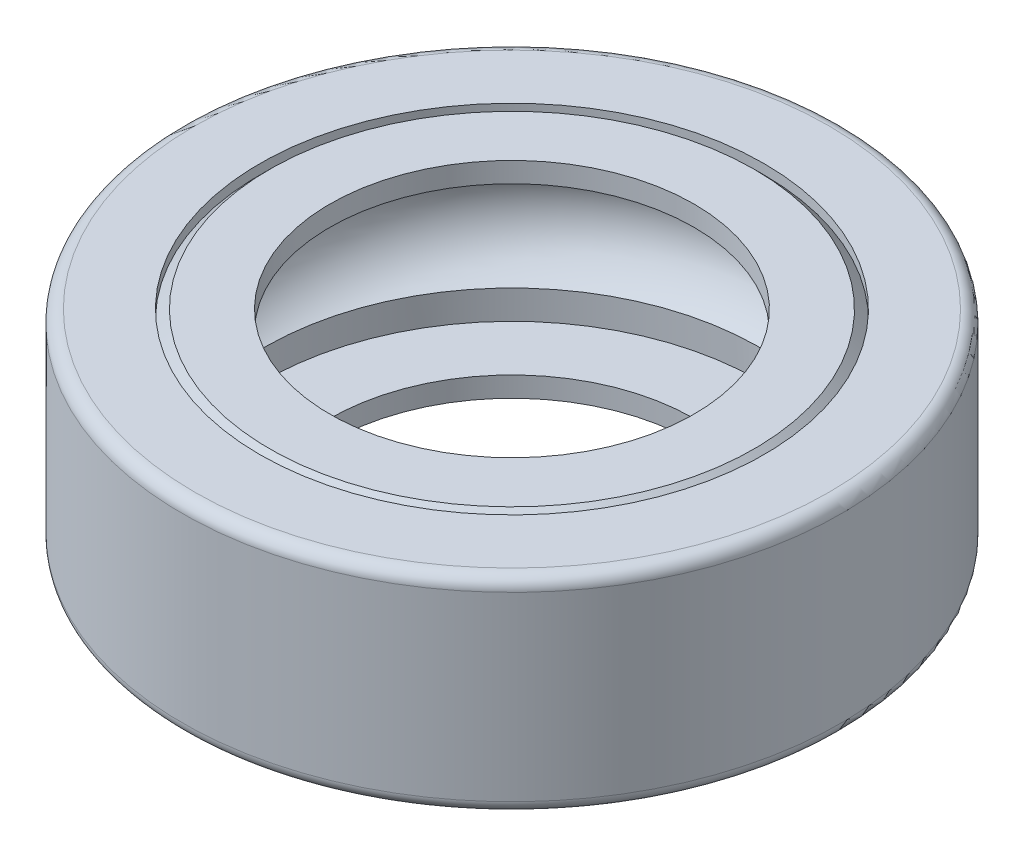
ISO-10303-21;
HEADER;
FILE_DESCRIPTION(('STEP AP214'),'2;1');
FILE_NAME('part.step','',(''),(''),'','','');
FILE_SCHEMA(('AUTOMOTIVE_DESIGN { 1 0 10303 214 1 1 1 1 }'));
ENDSEC;
DATA;
#1=APPLICATION_CONTEXT('core data for automotive mechanical design processes');
#2=APPLICATION_PROTOCOL_DEFINITION('international standard','automotive_design',2000,#1);
#3=PRODUCT_CONTEXT('',#1,'mechanical');
#4=PRODUCT('Part','Part','',(#3));
#5=PRODUCT_RELATED_PRODUCT_CATEGORY('part','',(#4));
#6=PRODUCT_DEFINITION_FORMATION('','',#4);
#7=PRODUCT_DEFINITION_CONTEXT('part definition',#1,'design');
#8=PRODUCT_DEFINITION('design','',#6,#7);
#9=PRODUCT_DEFINITION_SHAPE('','',#8);
#10=(LENGTH_UNIT() NAMED_UNIT(*) SI_UNIT(.MILLI.,.METRE.));
#11=(NAMED_UNIT(*) PLANE_ANGLE_UNIT() SI_UNIT($,.RADIAN.));
#12=(NAMED_UNIT(*) SI_UNIT($,.STERADIAN.) SOLID_ANGLE_UNIT());
#13=UNCERTAINTY_MEASURE_WITH_UNIT(LENGTH_MEASURE(1.E-05),#10,'distance_accuracy_value','');
#14=(GEOMETRIC_REPRESENTATION_CONTEXT(3) GLOBAL_UNCERTAINTY_ASSIGNED_CONTEXT((#13)) GLOBAL_UNIT_ASSIGNED_CONTEXT((#10,
#11,#12)) REPRESENTATION_CONTEXT('',''));
#15=CARTESIAN_POINT('',(0.,0.,0.));
#16=DIRECTION('',(0.,0.,1.));
#17=DIRECTION('',(1.,0.,0.));
#18=AXIS2_PLACEMENT_3D('',#15,#16,#17);
#19=CARTESIAN_POINT('',(0.,-2.5,0.));
#20=DIRECTION('',(0.,1.,0.));
#21=DIRECTION('',(0.,0.,1.));
#22=AXIS2_PLACEMENT_3D('',#19,#20,#21);
#23=CYLINDRICAL_SURFACE('',#22,8.);
#24=CARTESIAN_POINT('',(0.,-4.7,0.));
#25=DIRECTION('',(0.,1.,0.));
#26=DIRECTION('',(0.,0.,1.));
#27=AXIS2_PLACEMENT_3D('',#24,#25,#26);
#28=CIRCLE('',#27,8.);
#29=CARTESIAN_POINT('',(0.,-4.7,-8.));
#30=VERTEX_POINT('',#29);
#31=EDGE_CURVE('E10',#30,#30,#28,.T.);
#32=ORIENTED_EDGE('',*,*,#31,.T.);
#33=EDGE_LOOP('',(#32));
#34=FACE_BOUND('',#33,.T.);
#35=CARTESIAN_POINT('',(0.,-0.3,0.));
#36=DIRECTION('',(0.,1.,0.));
#37=DIRECTION('',(0.,0.,1.));
#38=AXIS2_PLACEMENT_3D('',#35,#36,#37);
#39=CIRCLE('',#38,8.);
#40=CARTESIAN_POINT('',(0.,-0.3,-8.));
#41=VERTEX_POINT('',#40);
#42=EDGE_CURVE('E180',#41,#41,#39,.T.);
#43=ORIENTED_EDGE('',*,*,#42,.F.);
#44=EDGE_LOOP('',(#43));
#45=FACE_BOUND('',#44,.T.);
#46=ADVANCED_FACE('F16',(#34,#45),#23,.T.);
#47=CARTESIAN_POINT('',(0.,-4.7,0.));
#48=DIRECTION('',(0.,1.,0.));
#49=DIRECTION('',(0.,0.,1.));
#50=AXIS2_PLACEMENT_3D('',#47,#48,#49);
#51=TOROIDAL_SURFACE('',#50,7.7,0.3);
#52=CARTESIAN_POINT('',(0.,-5.,0.));
#53=DIRECTION('',(0.,1.,0.));
#54=DIRECTION('',(0.,0.,1.));
#55=AXIS2_PLACEMENT_3D('',#52,#53,#54);
#56=CIRCLE('',#55,7.7);
#57=CARTESIAN_POINT('',(0.,-5.,-7.7));
#58=VERTEX_POINT('',#57);
#59=EDGE_CURVE('E27',#58,#58,#56,.T.);
#60=ORIENTED_EDGE('',*,*,#59,.T.);
#61=EDGE_LOOP('',(#60));
#62=FACE_BOUND('',#61,.T.);
#63=ORIENTED_EDGE('',*,*,#31,.F.);
#64=EDGE_LOOP('',(#63));
#65=FACE_BOUND('',#64,.T.);
#66=ADVANCED_FACE('F251',(#62,#65),#51,.T.);
#67=CARTESIAN_POINT('',(0.,-0.3,0.));
#68=DIRECTION('',(0.,1.,0.));
#69=DIRECTION('',(0.,0.,1.));
#70=AXIS2_PLACEMENT_3D('',#67,#68,#69);
#71=TOROIDAL_SURFACE('',#70,7.7,0.3);
#72=ORIENTED_EDGE('',*,*,#42,.T.);
#73=EDGE_LOOP('',(#72));
#74=FACE_BOUND('',#73,.T.);
#75=CARTESIAN_POINT('',(0.,0.,0.));
#76=DIRECTION('',(0.,1.,0.));
#77=DIRECTION('',(0.,0.,1.));
#78=AXIS2_PLACEMENT_3D('',#75,#76,#77);
#79=CIRCLE('',#78,7.7);
#80=CARTESIAN_POINT('',(0.,0.,-7.7));
#81=VERTEX_POINT('',#80);
#82=EDGE_CURVE('E173',#81,#81,#79,.T.);
#83=ORIENTED_EDGE('',*,*,#82,.F.);
#84=EDGE_LOOP('',(#83));
#85=FACE_BOUND('',#84,.T.);
#86=ADVANCED_FACE('F257',(#74,#85),#71,.T.);
#87=CARTESIAN_POINT('',(0.,-5.,6.91));
#88=DIRECTION('',(0.,-1.,0.));
#89=DIRECTION('',(-1.,0.,0.));
#90=AXIS2_PLACEMENT_3D('',#87,#88,#89);
#91=PLANE('',#90);
#92=ORIENTED_EDGE('',*,*,#59,.F.);
#93=EDGE_LOOP('',(#92));
#94=FACE_BOUND('',#93,.T.);
#95=CARTESIAN_POINT('',(0.,-5.,0.));
#96=DIRECTION('',(0.,1.,0.));
#97=DIRECTION('',(0.,0.,1.));
#98=AXIS2_PLACEMENT_3D('',#95,#96,#97);
#99=CIRCLE('',#98,6.12);
#100=CARTESIAN_POINT('',(0.,-5.,-6.12));
#101=VERTEX_POINT('',#100);
#102=EDGE_CURVE('E142',#101,#101,#99,.T.);
#103=ORIENTED_EDGE('',*,*,#102,.T.);
#104=EDGE_LOOP('',(#103));
#105=FACE_BOUND('',#104,.T.);
#106=ADVANCED_FACE('F290',(#94,#105),#91,.T.);
#107=CARTESIAN_POINT('',(0.,0.,6.91));
#108=DIRECTION('',(0.,1.,0.));
#109=DIRECTION('',(1.,0.,0.));
#110=AXIS2_PLACEMENT_3D('',#107,#108,#109);
#111=PLANE('',#110);
#112=CARTESIAN_POINT('',(0.,0.,0.));
#113=DIRECTION('',(0.,1.,0.));
#114=DIRECTION('',(0.,0.,1.));
#115=AXIS2_PLACEMENT_3D('',#112,#113,#114);
#116=CIRCLE('',#115,6.12);
#117=CARTESIAN_POINT('',(0.,0.,-6.12));
#118=VERTEX_POINT('',#117);
#119=EDGE_CURVE('E20',#118,#118,#116,.T.);
#120=ORIENTED_EDGE('',*,*,#119,.F.);
#121=EDGE_LOOP('',(#120));
#122=FACE_BOUND('',#121,.T.);
#123=ORIENTED_EDGE('',*,*,#82,.T.);
#124=EDGE_LOOP('',(#123));
#125=FACE_BOUND('',#124,.T.);
#126=ADVANCED_FACE('F287',(#122,#125),#111,.T.);
#127=CARTESIAN_POINT('',(0.,-4.75,0.));
#128=DIRECTION('',(0.,1.,0.));
#129=DIRECTION('',(0.,0.,1.));
#130=AXIS2_PLACEMENT_3D('',#127,#128,#129);
#131=CYLINDRICAL_SURFACE('',#130,6.12);
#132=ORIENTED_EDGE('',*,*,#102,.F.);
#133=EDGE_LOOP('',(#132));
#134=FACE_BOUND('',#133,.T.);
#135=CARTESIAN_POINT('',(0.,-4.76,0.));
#136=DIRECTION('',(0.,-1.,0.));
#137=DIRECTION('',(0.,0.,1.));
#138=AXIS2_PLACEMENT_3D('',#135,#136,#137);
#139=CIRCLE('',#138,6.12);
#140=CARTESIAN_POINT('',(0.,-4.76,-6.12));
#141=VERTEX_POINT('',#140);
#142=EDGE_CURVE('E182',#141,#141,#139,.T.);
#143=ORIENTED_EDGE('',*,*,#142,.F.);
#144=EDGE_LOOP('',(#143));
#145=FACE_BOUND('',#144,.T.);
#146=ADVANCED_FACE('F289',(#134,#145),#131,.F.);
#147=CARTESIAN_POINT('',(0.,-0.25,0.));
#148=DIRECTION('',(0.,1.,0.));
#149=DIRECTION('',(0.,0.,1.));
#150=AXIS2_PLACEMENT_3D('',#147,#148,#149);
#151=CYLINDRICAL_SURFACE('',#150,6.12);
#152=ORIENTED_EDGE('',*,*,#119,.T.);
#153=EDGE_LOOP('',(#152));
#154=FACE_BOUND('',#153,.T.);
#155=CARTESIAN_POINT('',(0.,-0.24,0.));
#156=DIRECTION('',(0.,1.,0.));
#157=DIRECTION('',(0.,0.,1.));
#158=AXIS2_PLACEMENT_3D('',#155,#156,#157);
#159=CIRCLE('',#158,6.12);
#160=CARTESIAN_POINT('',(0.,-0.24,-6.12));
#161=VERTEX_POINT('',#160);
#162=EDGE_CURVE('E189',#161,#161,#159,.T.);
#163=ORIENTED_EDGE('',*,*,#162,.F.);
#164=EDGE_LOOP('',(#163));
#165=FACE_BOUND('',#164,.T.);
#166=ADVANCED_FACE('F293',(#154,#165),#151,.F.);
#167=CARTESIAN_POINT('',(0.,-4.88,0.));
#168=DIRECTION('',(0.,1.,0.));
#169=DIRECTION('',(0.,0.,1.));
#170=AXIS2_PLACEMENT_3D('',#167,#168,#169);
#171=CONICAL_SURFACE('',#170,6.,0.785398163397449);
#172=ORIENTED_EDGE('',*,*,#142,.T.);
#173=EDGE_LOOP('',(#172));
#174=FACE_BOUND('',#173,.T.);
#175=CARTESIAN_POINT('',(0.,-5.,0.));
#176=DIRECTION('',(0.,-1.,0.));
#177=DIRECTION('',(0.,0.,1.));
#178=AXIS2_PLACEMENT_3D('',#175,#176,#177);
#179=CIRCLE('',#178,5.88);
#180=CARTESIAN_POINT('',(0.,-5.,-5.88));
#181=VERTEX_POINT('',#180);
#182=EDGE_CURVE('E135',#181,#181,#179,.T.);
#183=ORIENTED_EDGE('',*,*,#182,.F.);
#184=EDGE_LOOP('',(#183));
#185=FACE_BOUND('',#184,.T.);
#186=ADVANCED_FACE('F296',(#174,#185),#171,.T.);
#187=CARTESIAN_POINT('',(0.,-0.12,0.));
#188=DIRECTION('',(0.,-1.,0.));
#189=DIRECTION('',(0.,0.,1.));
#190=AXIS2_PLACEMENT_3D('',#187,#188,#189);
#191=CONICAL_SURFACE('',#190,6.,0.785398163397449);
#192=ORIENTED_EDGE('',*,*,#162,.T.);
#193=EDGE_LOOP('',(#192));
#194=FACE_BOUND('',#193,.T.);
#195=CARTESIAN_POINT('',(0.,0.,0.));
#196=DIRECTION('',(0.,1.,0.));
#197=DIRECTION('',(0.,0.,1.));
#198=AXIS2_PLACEMENT_3D('',#195,#196,#197);
#199=CIRCLE('',#198,5.88);
#200=CARTESIAN_POINT('',(0.,0.,-5.88));
#201=VERTEX_POINT('',#200);
#202=EDGE_CURVE('E126',#201,#201,#199,.T.);
#203=ORIENTED_EDGE('',*,*,#202,.F.);
#204=EDGE_LOOP('',(#203));
#205=FACE_BOUND('',#204,.T.);
#206=ADVANCED_FACE('F306',(#194,#205),#191,.T.);
#207=CARTESIAN_POINT('',(0.,-5.,5.15));
#208=DIRECTION('',(0.,-1.,0.));
#209=DIRECTION('',(-1.,0.,0.));
#210=AXIS2_PLACEMENT_3D('',#207,#208,#209);
#211=PLANE('',#210);
#212=CARTESIAN_POINT('',(0.,-5.,0.));
#213=DIRECTION('',(0.,-1.,0.));
#214=DIRECTION('',(0.,0.,1.));
#215=AXIS2_PLACEMENT_3D('',#212,#213,#214);
#216=CIRCLE('',#215,4.42);
#217=CARTESIAN_POINT('',(0.,-5.,-4.42));
#218=VERTEX_POINT('',#217);
#219=EDGE_CURVE('E121',#218,#218,#216,.T.);
#220=ORIENTED_EDGE('',*,*,#219,.F.);
#221=EDGE_LOOP('',(#220));
#222=FACE_BOUND('',#221,.T.);
#223=ORIENTED_EDGE('',*,*,#182,.T.);
#224=EDGE_LOOP('',(#223));
#225=FACE_BOUND('',#224,.T.);
#226=ADVANCED_FACE('F122',(#222,#225),#211,.T.);
#227=CARTESIAN_POINT('',(0.,0.,5.15));
#228=DIRECTION('',(0.,1.,0.));
#229=DIRECTION('',(1.,0.,0.));
#230=AXIS2_PLACEMENT_3D('',#227,#228,#229);
#231=PLANE('',#230);
#232=CARTESIAN_POINT('',(0.,0.,0.));
#233=DIRECTION('',(0.,1.,0.));
#234=DIRECTION('',(0.,0.,1.));
#235=AXIS2_PLACEMENT_3D('',#232,#233,#234);
#236=CIRCLE('',#235,4.42);
#237=CARTESIAN_POINT('',(0.,0.,-4.42));
#238=VERTEX_POINT('',#237);
#239=EDGE_CURVE('E127',#238,#238,#236,.T.);
#240=ORIENTED_EDGE('',*,*,#239,.F.);
#241=EDGE_LOOP('',(#240));
#242=FACE_BOUND('',#241,.T.);
#243=ORIENTED_EDGE('',*,*,#202,.T.);
#244=EDGE_LOOP('',(#243));
#245=FACE_BOUND('',#244,.T.);
#246=ADVANCED_FACE('F305',(#242,#245),#231,.T.);
#247=CARTESIAN_POINT('',(0.,-4.755,0.));
#248=DIRECTION('',(0.,-1.,0.));
#249=DIRECTION('',(0.,0.,1.));
#250=AXIS2_PLACEMENT_3D('',#247,#248,#249);
#251=CYLINDRICAL_SURFACE('',#250,4.42);
#252=ORIENTED_EDGE('',*,*,#219,.T.);
#253=EDGE_LOOP('',(#252));
#254=FACE_BOUND('',#253,.T.);
#255=CARTESIAN_POINT('',(0.,-4.51,0.));
#256=DIRECTION('',(0.,-1.,0.));
#257=DIRECTION('',(0.,0.,1.));
#258=AXIS2_PLACEMENT_3D('',#255,#256,#257);
#259=CIRCLE('',#258,4.42);
#260=CARTESIAN_POINT('',(0.,-4.51,-4.42));
#261=VERTEX_POINT('',#260);
#262=EDGE_CURVE('E139',#261,#261,#259,.T.);
#263=ORIENTED_EDGE('',*,*,#262,.F.);
#264=EDGE_LOOP('',(#263));
#265=FACE_BOUND('',#264,.T.);
#266=ADVANCED_FACE('F271',(#254,#265),#251,.F.);
#267=CARTESIAN_POINT('',(0.,-0.245,0.));
#268=DIRECTION('',(0.,1.,0.));
#269=DIRECTION('',(0.,0.,1.));
#270=AXIS2_PLACEMENT_3D('',#267,#268,#269);
#271=CYLINDRICAL_SURFACE('',#270,4.42);
#272=ORIENTED_EDGE('',*,*,#239,.T.);
#273=EDGE_LOOP('',(#272));
#274=FACE_BOUND('',#273,.T.);
#275=CARTESIAN_POINT('',(0.,-0.49,0.));
#276=DIRECTION('',(0.,1.,0.));
#277=DIRECTION('',(0.,0.,1.));
#278=AXIS2_PLACEMENT_3D('',#275,#276,#277);
#279=CIRCLE('',#278,4.42);
#280=CARTESIAN_POINT('',(0.,-0.49,-4.42));
#281=VERTEX_POINT('',#280);
#282=EDGE_CURVE('E145',#281,#281,#279,.T.);
#283=ORIENTED_EDGE('',*,*,#282,.F.);
#284=EDGE_LOOP('',(#283));
#285=FACE_BOUND('',#284,.T.);
#286=ADVANCED_FACE('F18',(#274,#285),#271,.F.);
#287=CARTESIAN_POINT('',(0.,-4.51,5.27));
#288=DIRECTION('',(0.,1.,0.));
#289=DIRECTION('',(1.,0.,0.));
#290=AXIS2_PLACEMENT_3D('',#287,#288,#289);
#291=PLANE('',#290);
#292=CARTESIAN_POINT('',(0.,-4.51,0.));
#293=DIRECTION('',(0.,-1.,0.));
#294=DIRECTION('',(0.,0.,1.));
#295=AXIS2_PLACEMENT_3D('',#292,#293,#294);
#296=CIRCLE('',#295,6.12);
#297=CARTESIAN_POINT('',(0.,-4.51,-6.12));
#298=VERTEX_POINT('',#297);
#299=EDGE_CURVE('E161',#298,#298,#296,.T.);
#300=ORIENTED_EDGE('',*,*,#299,.F.);
#301=EDGE_LOOP('',(#300));
#302=FACE_BOUND('',#301,.T.);
#303=ORIENTED_EDGE('',*,*,#262,.T.);
#304=EDGE_LOOP('',(#303));
#305=FACE_BOUND('',#304,.T.);
#306=ADVANCED_FACE('F261',(#302,#305),#291,.T.);
#307=CARTESIAN_POINT('',(0.,-0.49,5.27));
#308=DIRECTION('',(0.,-1.,0.));
#309=DIRECTION('',(-1.,0.,0.));
#310=AXIS2_PLACEMENT_3D('',#307,#308,#309);
#311=PLANE('',#310);
#312=CARTESIAN_POINT('',(0.,-0.49,0.));
#313=DIRECTION('',(0.,1.,0.));
#314=DIRECTION('',(0.,0.,1.));
#315=AXIS2_PLACEMENT_3D('',#312,#313,#314);
#316=CIRCLE('',#315,6.12);
#317=CARTESIAN_POINT('',(0.,-0.49,-6.12));
#318=VERTEX_POINT('',#317);
#319=EDGE_CURVE('E169',#318,#318,#316,.T.);
#320=ORIENTED_EDGE('',*,*,#319,.F.);
#321=EDGE_LOOP('',(#320));
#322=FACE_BOUND('',#321,.T.);
#323=ORIENTED_EDGE('',*,*,#282,.T.);
#324=EDGE_LOOP('',(#323));
#325=FACE_BOUND('',#324,.T.);
#326=ADVANCED_FACE('F263',(#322,#325),#311,.T.);
#327=CARTESIAN_POINT('',(0.,-4.75,0.));
#328=DIRECTION('',(0.,1.,0.));
#329=DIRECTION('',(0.,0.,1.));
#330=AXIS2_PLACEMENT_3D('',#327,#328,#329);
#331=CYLINDRICAL_SURFACE('',#330,6.12);
#332=CARTESIAN_POINT('',(0.,-4.5,0.));
#333=DIRECTION('',(0.,1.,0.));
#334=DIRECTION('',(0.,0.,1.));
#335=AXIS2_PLACEMENT_3D('',#332,#333,#334);
#336=CIRCLE('',#335,6.12);
#337=CARTESIAN_POINT('',(0.,-4.5,-6.12));
#338=VERTEX_POINT('',#337);
#339=EDGE_CURVE('E152',#338,#338,#336,.T.);
#340=ORIENTED_EDGE('',*,*,#339,.T.);
#341=EDGE_LOOP('',(#340));
#342=FACE_BOUND('',#341,.T.);
#343=ORIENTED_EDGE('',*,*,#299,.T.);
#344=EDGE_LOOP('',(#343));
#345=FACE_BOUND('',#344,.T.);
#346=ADVANCED_FACE('F245',(#342,#345),#331,.F.);
#347=CARTESIAN_POINT('',(0.,-2.5,0.));
#348=DIRECTION('',(0.,1.,0.));
#349=DIRECTION('',(0.,0.,1.));
#350=AXIS2_PLACEMENT_3D('',#347,#348,#349);
#351=TOROIDAL_SURFACE('',#350,5.25,1.5);
#352=CARTESIAN_POINT('',(0.,-1.20096189432334,0.));
#353=DIRECTION('',(0.,1.,0.));
#354=DIRECTION('',(0.,0.,1.));
#355=AXIS2_PLACEMENT_3D('',#352,#353,#354);
#356=CIRCLE('',#355,6.);
#357=CARTESIAN_POINT('',(4.24264068711929,-1.20096189432334,4.24264068711929));
#358=VERTEX_POINT('',#357);
#359=EDGE_CURVE('E167',#358,#358,#356,.T.);
#360=ORIENTED_EDGE('',*,*,#359,.T.);
#361=EDGE_LOOP('',(#360));
#362=FACE_BOUND('',#361,.T.);
#363=CARTESIAN_POINT('',(0.,-3.79903810567666,0.));
#364=DIRECTION('',(0.,1.,0.));
#365=DIRECTION('',(0.,0.,1.));
#366=AXIS2_PLACEMENT_3D('',#363,#364,#365);
#367=CIRCLE('',#366,6.);
#368=CARTESIAN_POINT('',(4.24264068711928,-3.79903810567666,4.24264068711928));
#369=VERTEX_POINT('',#368);
#370=EDGE_CURVE('E214',#369,#369,#367,.T.);
#371=ORIENTED_EDGE('',*,*,#370,.F.);
#372=EDGE_LOOP('',(#371));
#373=FACE_BOUND('',#372,.T.);
#374=ADVANCED_FACE('F234',(#362,#373),#351,.F.);
#375=CARTESIAN_POINT('',(0.,-0.25,0.));
#376=DIRECTION('',(0.,1.,0.));
#377=DIRECTION('',(0.,0.,1.));
#378=AXIS2_PLACEMENT_3D('',#375,#376,#377);
#379=CYLINDRICAL_SURFACE('',#378,6.12);
#380=ORIENTED_EDGE('',*,*,#319,.T.);
#381=EDGE_LOOP('',(#380));
#382=FACE_BOUND('',#381,.T.);
#383=CARTESIAN_POINT('',(0.,-0.5,0.));
#384=DIRECTION('',(0.,1.,0.));
#385=DIRECTION('',(0.,0.,1.));
#386=AXIS2_PLACEMENT_3D('',#383,#384,#385);
#387=CIRCLE('',#386,6.12);
#388=CARTESIAN_POINT('',(0.,-0.5,-6.12));
#389=VERTEX_POINT('',#388);
#390=EDGE_CURVE('E213',#389,#389,#387,.T.);
#391=ORIENTED_EDGE('',*,*,#390,.F.);
#392=EDGE_LOOP('',(#391));
#393=FACE_BOUND('',#392,.T.);
#394=ADVANCED_FACE('F231',(#382,#393),#379,.F.);
#395=CARTESIAN_POINT('',(0.,-4.5,6.06));
#396=DIRECTION('',(0.,-1.,0.));
#397=DIRECTION('',(-1.,0.,0.));
#398=AXIS2_PLACEMENT_3D('',#395,#396,#397);
#399=PLANE('',#398);
#400=ORIENTED_EDGE('',*,*,#339,.F.);
#401=EDGE_LOOP('',(#400));
#402=FACE_BOUND('',#401,.T.);
#403=CARTESIAN_POINT('',(0.,-4.5,0.));
#404=DIRECTION('',(0.,1.,0.));
#405=DIRECTION('',(0.,0.,1.));
#406=AXIS2_PLACEMENT_3D('',#403,#404,#405);
#407=CIRCLE('',#406,6.);
#408=CARTESIAN_POINT('',(0.,-4.5,-6.));
#409=VERTEX_POINT('',#408);
#410=EDGE_CURVE('E172',#409,#409,#407,.T.);
#411=ORIENTED_EDGE('',*,*,#410,.T.);
#412=EDGE_LOOP('',(#411));
#413=FACE_BOUND('',#412,.T.);
#414=ADVANCED_FACE('F233',(#402,#413),#399,.T.);
#415=CARTESIAN_POINT('',(0.,-4.14951905283833,0.));
#416=DIRECTION('',(0.,1.,0.));
#417=DIRECTION('',(0.,0.,1.));
#418=AXIS2_PLACEMENT_3D('',#415,#416,#417);
#419=CYLINDRICAL_SURFACE('',#418,6.);
#420=ORIENTED_EDGE('',*,*,#370,.T.);
#421=EDGE_LOOP('',(#420));
#422=FACE_BOUND('',#421,.T.);
#423=ORIENTED_EDGE('',*,*,#410,.F.);
#424=EDGE_LOOP('',(#423));
#425=FACE_BOUND('',#424,.T.);
#426=ADVANCED_FACE('F242',(#422,#425),#419,.F.);
#427=CARTESIAN_POINT('',(0.,-0.5,6.06));
#428=DIRECTION('',(0.,1.,0.));
#429=DIRECTION('',(1.,0.,0.));
#430=AXIS2_PLACEMENT_3D('',#427,#428,#429);
#431=PLANE('',#430);
#432=CARTESIAN_POINT('',(0.,-0.5,0.));
#433=DIRECTION('',(0.,1.,0.));
#434=DIRECTION('',(0.,0.,1.));
#435=AXIS2_PLACEMENT_3D('',#432,#433,#434);
#436=CIRCLE('',#435,6.);
#437=CARTESIAN_POINT('',(0.,-0.5,-6.));
#438=VERTEX_POINT('',#437);
#439=EDGE_CURVE('E210',#438,#438,#436,.T.);
#440=ORIENTED_EDGE('',*,*,#439,.F.);
#441=EDGE_LOOP('',(#440));
#442=FACE_BOUND('',#441,.T.);
#443=ORIENTED_EDGE('',*,*,#390,.T.);
#444=EDGE_LOOP('',(#443));
#445=FACE_BOUND('',#444,.T.);
#446=ADVANCED_FACE('F229',(#442,#445),#431,.T.);
#447=CARTESIAN_POINT('',(0.,-0.850480947161672,0.));
#448=DIRECTION('',(0.,1.,0.));
#449=DIRECTION('',(0.,0.,1.));
#450=AXIS2_PLACEMENT_3D('',#447,#448,#449);
#451=CYLINDRICAL_SURFACE('',#450,6.);
#452=ORIENTED_EDGE('',*,*,#439,.T.);
#453=EDGE_LOOP('',(#452));
#454=FACE_BOUND('',#453,.T.);
#455=ORIENTED_EDGE('',*,*,#359,.F.);
#456=EDGE_LOOP('',(#455));
#457=FACE_BOUND('',#456,.T.);
#458=ADVANCED_FACE('F280',(#454,#457),#451,.F.);
#459=CLOSED_SHELL('',(#46,#66,#86,#106,#126,#146,#166,#186,#206,#226,#246,#266,#286,#306,#326,
#346,#374,#394,#414,#426,#446,#458));
#460=MANIFOLD_SOLID_BREP('B1',#459);
#461=ADVANCED_BREP_SHAPE_REPRESENTATION('',(#18,#460),#14);
#462=SHAPE_DEFINITION_REPRESENTATION(#9,#461);
ENDSEC;
END-ISO-10303-21;
